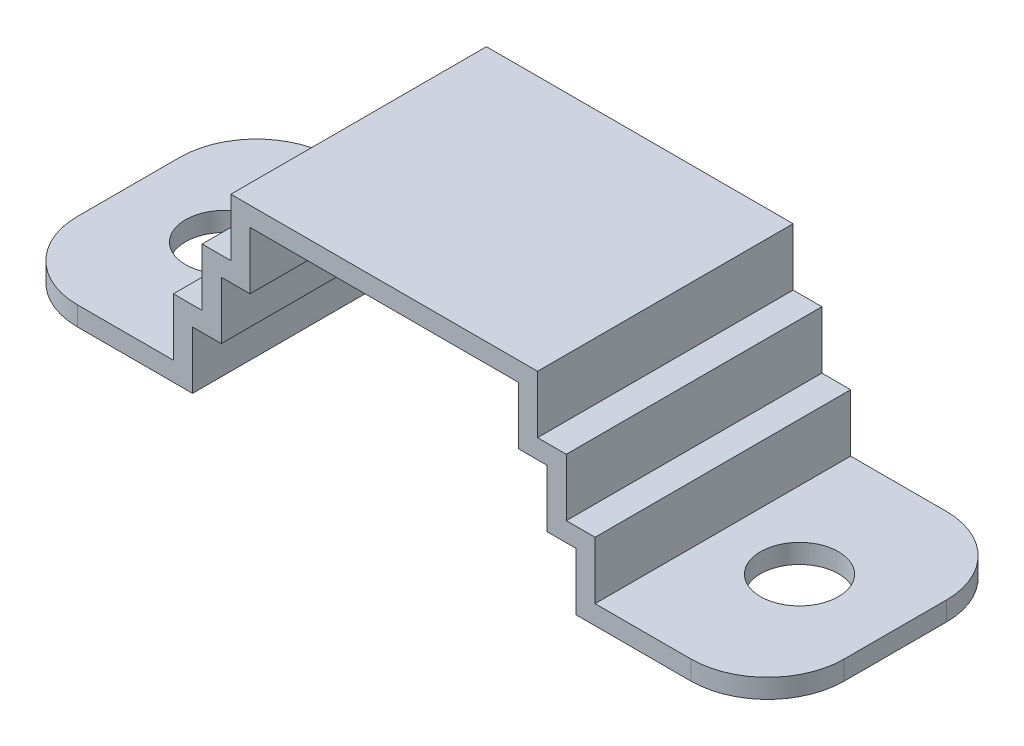
ISO-10303-21;
HEADER;
FILE_DESCRIPTION(('STEP AP214'),'2;1');
FILE_NAME('part.step','',(''),(''),'','','');
FILE_SCHEMA(('AUTOMOTIVE_DESIGN { 1 0 10303 214 1 1 1 1 }'));
ENDSEC;
DATA;
#1=APPLICATION_CONTEXT('core data for automotive mechanical design processes');
#2=APPLICATION_PROTOCOL_DEFINITION('international standard','automotive_design',2000,#1);
#3=PRODUCT_CONTEXT('',#1,'mechanical');
#4=PRODUCT('Part','Part','',(#3));
#5=PRODUCT_RELATED_PRODUCT_CATEGORY('part','',(#4));
#6=PRODUCT_DEFINITION_FORMATION('','',#4);
#7=PRODUCT_DEFINITION_CONTEXT('part definition',#1,'design');
#8=PRODUCT_DEFINITION('design','',#6,#7);
#9=PRODUCT_DEFINITION_SHAPE('','',#8);
#10=(LENGTH_UNIT() NAMED_UNIT(*) SI_UNIT(.MILLI.,.METRE.));
#11=(NAMED_UNIT(*) PLANE_ANGLE_UNIT() SI_UNIT($,.RADIAN.));
#12=(NAMED_UNIT(*) SI_UNIT($,.STERADIAN.) SOLID_ANGLE_UNIT());
#13=UNCERTAINTY_MEASURE_WITH_UNIT(LENGTH_MEASURE(1.E-05),#10,'distance_accuracy_value','');
#14=(GEOMETRIC_REPRESENTATION_CONTEXT(3) GLOBAL_UNCERTAINTY_ASSIGNED_CONTEXT((#13)) GLOBAL_UNIT_ASSIGNED_CONTEXT((#10,
#11,#12)) REPRESENTATION_CONTEXT('',''));
#15=CARTESIAN_POINT('',(0.,0.,0.));
#16=DIRECTION('',(0.,0.,1.));
#17=DIRECTION('',(1.,0.,0.));
#18=AXIS2_PLACEMENT_3D('',#15,#16,#17);
#19=CARTESIAN_POINT('',(-21.,27.,-20.));
#20=DIRECTION('',(0.,-1.,0.));
#21=DIRECTION('',(0.,0.,-1.));
#22=AXIS2_PLACEMENT_3D('',#19,#20,#21);
#23=PLANE('',#22);
#24=DIRECTION('',(1.,0.,0.));
#25=VECTOR('',#24,1.);
#26=CARTESIAN_POINT('',(-21.,27.,20.));
#27=LINE('',#26,#25);
#28=CARTESIAN_POINT('',(-21.,27.,20.));
#29=VERTEX_POINT('',#28);
#30=CARTESIAN_POINT('',(21.,27.,20.));
#31=VERTEX_POINT('',#30);
#32=EDGE_CURVE('E319',#29,#31,#27,.T.);
#33=ORIENTED_EDGE('',*,*,#32,.F.);
#34=DIRECTION('',(0.,0.,1.));
#35=VECTOR('',#34,1.);
#36=CARTESIAN_POINT('',(-21.,27.,-20.));
#37=LINE('',#36,#35);
#38=CARTESIAN_POINT('',(-21.,27.,-20.));
#39=VERTEX_POINT('',#38);
#40=EDGE_CURVE('E257',#39,#29,#37,.T.);
#41=ORIENTED_EDGE('',*,*,#40,.F.);
#42=DIRECTION('',(1.,0.,0.));
#43=VECTOR('',#42,1.);
#44=CARTESIAN_POINT('',(-21.,27.,-20.));
#45=LINE('',#44,#43);
#46=CARTESIAN_POINT('',(21.,27.,-20.));
#47=VERTEX_POINT('',#46);
#48=EDGE_CURVE('E252',#39,#47,#45,.T.);
#49=ORIENTED_EDGE('',*,*,#48,.T.);
#50=DIRECTION('',(0.,0.,1.));
#51=VECTOR('',#50,1.);
#52=CARTESIAN_POINT('',(21.,27.,-20.));
#53=LINE('',#52,#51);
#54=EDGE_CURVE('E256',#47,#31,#53,.T.);
#55=ORIENTED_EDGE('',*,*,#54,.T.);
#56=EDGE_LOOP('',(#33,#41,#49,#55));
#57=FACE_BOUND('',#56,.T.);
#58=ADVANCED_FACE('F42',(#57),#23,.T.);
#59=CARTESIAN_POINT('',(-21.,18.,-20.));
#60=DIRECTION('',(1.,0.,0.));
#61=DIRECTION('',(0.,0.,-1.));
#62=AXIS2_PLACEMENT_3D('',#59,#60,#61);
#63=PLANE('',#62);
#64=DIRECTION('',(0.,1.,0.));
#65=VECTOR('',#64,1.);
#66=CARTESIAN_POINT('',(-21.,18.,20.));
#67=LINE('',#66,#65);
#68=CARTESIAN_POINT('',(-21.,18.,20.));
#69=VERTEX_POINT('',#68);
#70=EDGE_CURVE('E262',#69,#29,#67,.T.);
#71=ORIENTED_EDGE('',*,*,#70,.F.);
#72=DIRECTION('',(0.,0.,1.));
#73=VECTOR('',#72,1.);
#74=CARTESIAN_POINT('',(-21.,18.,-20.));
#75=LINE('',#74,#73);
#76=CARTESIAN_POINT('',(-21.,18.,-20.));
#77=VERTEX_POINT('',#76);
#78=EDGE_CURVE('E354',#77,#69,#75,.T.);
#79=ORIENTED_EDGE('',*,*,#78,.F.);
#80=DIRECTION('',(0.,1.,0.));
#81=VECTOR('',#80,1.);
#82=CARTESIAN_POINT('',(-21.,18.,-20.));
#83=LINE('',#82,#81);
#84=EDGE_CURVE('E316',#77,#39,#83,.T.);
#85=ORIENTED_EDGE('',*,*,#84,.T.);
#86=ORIENTED_EDGE('',*,*,#40,.T.);
#87=EDGE_LOOP('',(#71,#79,#85,#86));
#88=FACE_BOUND('',#87,.T.);
#89=ADVANCED_FACE('F603',(#88),#63,.T.);
#90=CARTESIAN_POINT('',(-25.5,18.,-20.));
#91=DIRECTION('',(0.,-1.,0.));
#92=DIRECTION('',(0.,0.,-1.));
#93=AXIS2_PLACEMENT_3D('',#90,#91,#92);
#94=PLANE('',#93);
#95=DIRECTION('',(1.,0.,0.));
#96=VECTOR('',#95,1.);
#97=CARTESIAN_POINT('',(-25.5,18.,20.));
#98=LINE('',#97,#96);
#99=CARTESIAN_POINT('',(-25.5,18.,20.));
#100=VERTEX_POINT('',#99);
#101=EDGE_CURVE('E347',#100,#69,#98,.T.);
#102=ORIENTED_EDGE('',*,*,#101,.F.);
#103=DIRECTION('',(0.,0.,1.));
#104=VECTOR('',#103,1.);
#105=CARTESIAN_POINT('',(-25.5,18.,-20.));
#106=LINE('',#105,#104);
#107=CARTESIAN_POINT('',(-25.5,18.,-20.));
#108=VERTEX_POINT('',#107);
#109=EDGE_CURVE('E356',#108,#100,#106,.T.);
#110=ORIENTED_EDGE('',*,*,#109,.F.);
#111=DIRECTION('',(1.,0.,0.));
#112=VECTOR('',#111,1.);
#113=CARTESIAN_POINT('',(-25.5,18.,-20.));
#114=LINE('',#113,#112);
#115=EDGE_CURVE('E313',#108,#77,#114,.T.);
#116=ORIENTED_EDGE('',*,*,#115,.T.);
#117=ORIENTED_EDGE('',*,*,#78,.T.);
#118=EDGE_LOOP('',(#102,#110,#116,#117));
#119=FACE_BOUND('',#118,.T.);
#120=ADVANCED_FACE('F600',(#119),#94,.T.);
#121=CARTESIAN_POINT('',(-25.5,9.,-20.));
#122=DIRECTION('',(1.,0.,0.));
#123=DIRECTION('',(0.,0.,-1.));
#124=AXIS2_PLACEMENT_3D('',#121,#122,#123);
#125=PLANE('',#124);
#126=DIRECTION('',(0.,1.,0.));
#127=VECTOR('',#126,1.);
#128=CARTESIAN_POINT('',(-25.5,9.,20.));
#129=LINE('',#128,#127);
#130=CARTESIAN_POINT('',(-25.5,9.,20.));
#131=VERTEX_POINT('',#130);
#132=EDGE_CURVE('E344',#131,#100,#129,.T.);
#133=ORIENTED_EDGE('',*,*,#132,.F.);
#134=DIRECTION('',(0.,0.,1.));
#135=VECTOR('',#134,1.);
#136=CARTESIAN_POINT('',(-25.5,9.,-20.));
#137=LINE('',#136,#135);
#138=CARTESIAN_POINT('',(-25.5,9.,-20.));
#139=VERTEX_POINT('',#138);
#140=EDGE_CURVE('E358',#139,#131,#137,.T.);
#141=ORIENTED_EDGE('',*,*,#140,.F.);
#142=DIRECTION('',(0.,1.,0.));
#143=VECTOR('',#142,1.);
#144=CARTESIAN_POINT('',(-25.5,9.,-20.));
#145=LINE('',#144,#143);
#146=EDGE_CURVE('E310',#139,#108,#145,.T.);
#147=ORIENTED_EDGE('',*,*,#146,.T.);
#148=ORIENTED_EDGE('',*,*,#109,.T.);
#149=EDGE_LOOP('',(#133,#141,#147,#148));
#150=FACE_BOUND('',#149,.T.);
#151=ADVANCED_FACE('F596',(#150),#125,.T.);
#152=CARTESIAN_POINT('',(-30.,9.,-20.));
#153=DIRECTION('',(0.,-1.,0.));
#154=DIRECTION('',(0.,0.,-1.));
#155=AXIS2_PLACEMENT_3D('',#152,#153,#154);
#156=PLANE('',#155);
#157=DIRECTION('',(1.,0.,0.));
#158=VECTOR('',#157,1.);
#159=CARTESIAN_POINT('',(-30.,9.,20.));
#160=LINE('',#159,#158);
#161=CARTESIAN_POINT('',(-30.,9.,20.));
#162=VERTEX_POINT('',#161);
#163=EDGE_CURVE('E341',#162,#131,#160,.T.);
#164=ORIENTED_EDGE('',*,*,#163,.F.);
#165=DIRECTION('',(0.,0.,1.));
#166=VECTOR('',#165,1.);
#167=CARTESIAN_POINT('',(-30.,9.,-20.));
#168=LINE('',#167,#166);
#169=CARTESIAN_POINT('',(-30.,9.,-20.));
#170=VERTEX_POINT('',#169);
#171=EDGE_CURVE('E360',#170,#162,#168,.T.);
#172=ORIENTED_EDGE('',*,*,#171,.F.);
#173=DIRECTION('',(1.,0.,0.));
#174=VECTOR('',#173,1.);
#175=CARTESIAN_POINT('',(-30.,9.,-20.));
#176=LINE('',#175,#174);
#177=EDGE_CURVE('E307',#170,#139,#176,.T.);
#178=ORIENTED_EDGE('',*,*,#177,.T.);
#179=ORIENTED_EDGE('',*,*,#140,.T.);
#180=EDGE_LOOP('',(#164,#172,#178,#179));
#181=FACE_BOUND('',#180,.T.);
#182=ADVANCED_FACE('F593',(#181),#156,.T.);
#183=CARTESIAN_POINT('',(-30.,0.,-20.));
#184=DIRECTION('',(1.,0.,0.));
#185=DIRECTION('',(0.,0.,-1.));
#186=AXIS2_PLACEMENT_3D('',#183,#184,#185);
#187=PLANE('',#186);
#188=DIRECTION('',(0.,1.,0.));
#189=VECTOR('',#188,1.);
#190=CARTESIAN_POINT('',(-30.,0.,20.));
#191=LINE('',#190,#189);
#192=CARTESIAN_POINT('',(-30.,0.,20.));
#193=VERTEX_POINT('',#192);
#194=EDGE_CURVE('E338',#193,#162,#191,.T.);
#195=ORIENTED_EDGE('',*,*,#194,.F.);
#196=DIRECTION('',(0.,0.,1.));
#197=VECTOR('',#196,1.);
#198=CARTESIAN_POINT('',(-30.,0.,-20.));
#199=LINE('',#198,#197);
#200=CARTESIAN_POINT('',(-30.,0.,-20.));
#201=VERTEX_POINT('',#200);
#202=EDGE_CURVE('E362',#201,#193,#199,.T.);
#203=ORIENTED_EDGE('',*,*,#202,.F.);
#204=DIRECTION('',(0.,1.,0.));
#205=VECTOR('',#204,1.);
#206=CARTESIAN_POINT('',(-30.,0.,-20.));
#207=LINE('',#206,#205);
#208=EDGE_CURVE('E304',#201,#170,#207,.T.);
#209=ORIENTED_EDGE('',*,*,#208,.T.);
#210=ORIENTED_EDGE('',*,*,#171,.T.);
#211=EDGE_LOOP('',(#195,#203,#209,#210));
#212=FACE_BOUND('',#211,.T.);
#213=ADVANCED_FACE('F589',(#212),#187,.T.);
#214=CARTESIAN_POINT('',(-60.,0.,-20.));
#215=DIRECTION('',(0.,-1.,0.));
#216=DIRECTION('',(0.,0.,-1.));
#217=AXIS2_PLACEMENT_3D('',#214,#215,#216);
#218=PLANE('',#217);
#219=CARTESIAN_POINT('',(-45.,0.,0.));
#220=DIRECTION('',(0.,1.,0.));
#221=DIRECTION('',(0.,0.,1.));
#222=AXIS2_PLACEMENT_3D('',#219,#220,#221);
#223=CIRCLE('',#222,6.1);
#224=CARTESIAN_POINT('',(-45.,0.,6.1));
#225=VERTEX_POINT('',#224);
#226=EDGE_CURVE('E468',#225,#225,#223,.T.);
#227=ORIENTED_EDGE('',*,*,#226,.T.);
#228=EDGE_LOOP('',(#227));
#229=FACE_BOUND('',#228,.T.);
#230=DIRECTION('',(0.,0.,1.));
#231=VECTOR('',#230,1.);
#232=CARTESIAN_POINT('',(-60.,0.,-20.));
#233=LINE('',#232,#231);
#234=CARTESIAN_POINT('',(-60.,0.,-8.));
#235=VERTEX_POINT('',#234);
#236=CARTESIAN_POINT('',(-60.,0.,8.));
#237=VERTEX_POINT('',#236);
#238=EDGE_CURVE('E365',#235,#237,#233,.T.);
#239=ORIENTED_EDGE('',*,*,#238,.F.);
#240=CARTESIAN_POINT('',(-48.,0.,-8.));
#241=DIRECTION('',(0.,-1.,0.));
#242=DIRECTION('',(0.,0.,-1.));
#243=AXIS2_PLACEMENT_3D('',#240,#241,#242);
#244=CIRCLE('',#243,12.);
#245=CARTESIAN_POINT('',(-48.,0.,-20.));
#246=VERTEX_POINT('',#245);
#247=EDGE_CURVE('E403',#235,#246,#244,.T.);
#248=ORIENTED_EDGE('',*,*,#247,.T.);
#249=DIRECTION('',(1.,0.,0.));
#250=VECTOR('',#249,1.);
#251=CARTESIAN_POINT('',(-60.,0.,-20.));
#252=LINE('',#251,#250);
#253=EDGE_CURVE('E302',#246,#201,#252,.T.);
#254=ORIENTED_EDGE('',*,*,#253,.T.);
#255=ORIENTED_EDGE('',*,*,#202,.T.);
#256=DIRECTION('',(1.,0.,0.));
#257=VECTOR('',#256,1.);
#258=CARTESIAN_POINT('',(-60.,0.,20.));
#259=LINE('',#258,#257);
#260=CARTESIAN_POINT('',(-48.,0.,20.));
#261=VERTEX_POINT('',#260);
#262=EDGE_CURVE('E336',#261,#193,#259,.T.);
#263=ORIENTED_EDGE('',*,*,#262,.F.);
#264=CARTESIAN_POINT('',(-48.,0.,8.));
#265=DIRECTION('',(0.,-1.,0.));
#266=DIRECTION('',(0.,0.,-1.));
#267=AXIS2_PLACEMENT_3D('',#264,#265,#266);
#268=CIRCLE('',#267,12.);
#269=EDGE_CURVE('E401',#261,#237,#268,.T.);
#270=ORIENTED_EDGE('',*,*,#269,.T.);
#271=EDGE_LOOP('',(#239,#248,#254,#255,#263,#270));
#272=FACE_BOUND('',#271,.T.);
#273=ADVANCED_FACE('F579',(#229,#272),#218,.T.);
#274=CARTESIAN_POINT('',(-60.,0.,-20.));
#275=DIRECTION('',(1.,0.,0.));
#276=DIRECTION('',(0.,0.,-1.));
#277=AXIS2_PLACEMENT_3D('',#274,#275,#276);
#278=PLANE('',#277);
#279=DIRECTION('',(0.,0.,1.));
#280=VECTOR('',#279,1.);
#281=CARTESIAN_POINT('',(-60.,3.,-20.));
#282=LINE('',#281,#280);
#283=CARTESIAN_POINT('',(-60.,3.,-8.));
#284=VERTEX_POINT('',#283);
#285=CARTESIAN_POINT('',(-60.,3.,8.));
#286=VERTEX_POINT('',#285);
#287=EDGE_CURVE('E368',#284,#286,#282,.T.);
#288=ORIENTED_EDGE('',*,*,#287,.F.);
#289=DIRECTION('',(0.,1.,0.));
#290=VECTOR('',#289,1.);
#291=CARTESIAN_POINT('',(-60.,0.,-8.));
#292=LINE('',#291,#290);
#293=EDGE_CURVE('E399',#284,#235,#292,.F.);
#294=ORIENTED_EDGE('',*,*,#293,.T.);
#295=ORIENTED_EDGE('',*,*,#238,.T.);
#296=DIRECTION('',(0.,1.,0.));
#297=VECTOR('',#296,1.);
#298=CARTESIAN_POINT('',(-60.,0.,8.));
#299=LINE('',#298,#297);
#300=EDGE_CURVE('E396',#237,#286,#299,.T.);
#301=ORIENTED_EDGE('',*,*,#300,.T.);
#302=EDGE_LOOP('',(#288,#294,#295,#301));
#303=FACE_BOUND('',#302,.T.);
#304=ADVANCED_FACE('F574',(#303),#278,.F.);
#305=CARTESIAN_POINT('',(-60.,3.,-20.));
#306=DIRECTION('',(0.,-1.,0.));
#307=DIRECTION('',(0.,0.,-1.));
#308=AXIS2_PLACEMENT_3D('',#305,#306,#307);
#309=PLANE('',#308);
#310=CARTESIAN_POINT('',(-45.,3.,0.));
#311=DIRECTION('',(0.,1.,0.));
#312=DIRECTION('',(0.,0.,1.));
#313=AXIS2_PLACEMENT_3D('',#310,#311,#312);
#314=CIRCLE('',#313,6.1);
#315=CARTESIAN_POINT('',(-45.,3.,6.1));
#316=VERTEX_POINT('',#315);
#317=EDGE_CURVE('E660',#316,#316,#314,.T.);
#318=ORIENTED_EDGE('',*,*,#317,.F.);
#319=EDGE_LOOP('',(#318));
#320=FACE_BOUND('',#319,.T.);
#321=DIRECTION('',(1.,0.,0.));
#322=VECTOR('',#321,1.);
#323=CARTESIAN_POINT('',(-60.,3.,-20.));
#324=LINE('',#323,#322);
#325=CARTESIAN_POINT('',(-48.,3.,-20.));
#326=VERTEX_POINT('',#325);
#327=CARTESIAN_POINT('',(-33.,3.,-20.));
#328=VERTEX_POINT('',#327);
#329=EDGE_CURVE('E300',#326,#328,#324,.T.);
#330=ORIENTED_EDGE('',*,*,#329,.F.);
#331=CARTESIAN_POINT('',(-48.,3.,-8.));
#332=DIRECTION('',(0.,-1.,0.));
#333=DIRECTION('',(0.,0.,-1.));
#334=AXIS2_PLACEMENT_3D('',#331,#332,#333);
#335=CIRCLE('',#334,12.);
#336=EDGE_CURVE('E394',#326,#284,#335,.F.);
#337=ORIENTED_EDGE('',*,*,#336,.T.);
#338=ORIENTED_EDGE('',*,*,#287,.T.);
#339=CARTESIAN_POINT('',(-48.,3.,8.));
#340=DIRECTION('',(0.,-1.,0.));
#341=DIRECTION('',(0.,0.,-1.));
#342=AXIS2_PLACEMENT_3D('',#339,#340,#341);
#343=CIRCLE('',#342,12.);
#344=CARTESIAN_POINT('',(-48.,3.,20.));
#345=VERTEX_POINT('',#344);
#346=EDGE_CURVE('E392',#286,#345,#343,.F.);
#347=ORIENTED_EDGE('',*,*,#346,.T.);
#348=DIRECTION('',(1.,0.,0.));
#349=VECTOR('',#348,1.);
#350=CARTESIAN_POINT('',(-60.,3.,20.));
#351=LINE('',#350,#349);
#352=CARTESIAN_POINT('',(-33.,3.,20.));
#353=VERTEX_POINT('',#352);
#354=EDGE_CURVE('E334',#345,#353,#351,.T.);
#355=ORIENTED_EDGE('',*,*,#354,.T.);
#356=DIRECTION('',(0.,0.,1.));
#357=VECTOR('',#356,1.);
#358=CARTESIAN_POINT('',(-33.,3.,-20.));
#359=LINE('',#358,#357);
#360=EDGE_CURVE('E371',#328,#353,#359,.T.);
#361=ORIENTED_EDGE('',*,*,#360,.F.);
#362=EDGE_LOOP('',(#330,#337,#338,#347,#355,#361));
#363=FACE_BOUND('',#362,.T.);
#364=ADVANCED_FACE('F567',(#320,#363),#309,.F.);
#365=CARTESIAN_POINT('',(-33.,0.,-20.));
#366=DIRECTION('',(1.,0.,0.));
#367=DIRECTION('',(0.,0.,-1.));
#368=AXIS2_PLACEMENT_3D('',#365,#366,#367);
#369=PLANE('',#368);
#370=DIRECTION('',(0.,1.,0.));
#371=VECTOR('',#370,1.);
#372=CARTESIAN_POINT('',(-33.,0.,20.));
#373=LINE('',#372,#371);
#374=CARTESIAN_POINT('',(-33.,12.,20.));
#375=VERTEX_POINT('',#374);
#376=EDGE_CURVE('E332',#353,#375,#373,.T.);
#377=ORIENTED_EDGE('',*,*,#376,.T.);
#378=DIRECTION('',(0.,0.,1.));
#379=VECTOR('',#378,1.);
#380=CARTESIAN_POINT('',(-33.,12.,-20.));
#381=LINE('',#380,#379);
#382=CARTESIAN_POINT('',(-33.,12.,-20.));
#383=VERTEX_POINT('',#382);
#384=EDGE_CURVE('E374',#383,#375,#381,.T.);
#385=ORIENTED_EDGE('',*,*,#384,.F.);
#386=DIRECTION('',(0.,1.,0.));
#387=VECTOR('',#386,1.);
#388=CARTESIAN_POINT('',(-33.,0.,-20.));
#389=LINE('',#388,#387);
#390=EDGE_CURVE('E298',#328,#383,#389,.T.);
#391=ORIENTED_EDGE('',*,*,#390,.F.);
#392=ORIENTED_EDGE('',*,*,#360,.T.);
#393=EDGE_LOOP('',(#377,#385,#391,#392));
#394=FACE_BOUND('',#393,.T.);
#395=ADVANCED_FACE('F562',(#394),#369,.F.);
#396=CARTESIAN_POINT('',(-30.,12.,-20.));
#397=DIRECTION('',(0.,-1.,0.));
#398=DIRECTION('',(0.,0.,-1.));
#399=AXIS2_PLACEMENT_3D('',#396,#397,#398);
#400=PLANE('',#399);
#401=DIRECTION('',(1.,0.,0.));
#402=VECTOR('',#401,1.);
#403=CARTESIAN_POINT('',(-30.,12.,20.));
#404=LINE('',#403,#402);
#405=CARTESIAN_POINT('',(-28.5,12.,20.));
#406=VERTEX_POINT('',#405);
#407=EDGE_CURVE('E330',#375,#406,#404,.T.);
#408=ORIENTED_EDGE('',*,*,#407,.T.);
#409=DIRECTION('',(0.,0.,1.));
#410=VECTOR('',#409,1.);
#411=CARTESIAN_POINT('',(-28.5,12.,-20.));
#412=LINE('',#411,#410);
#413=CARTESIAN_POINT('',(-28.5,12.,-20.));
#414=VERTEX_POINT('',#413);
#415=EDGE_CURVE('E377',#414,#406,#412,.T.);
#416=ORIENTED_EDGE('',*,*,#415,.F.);
#417=DIRECTION('',(1.,0.,0.));
#418=VECTOR('',#417,1.);
#419=CARTESIAN_POINT('',(-30.,12.,-20.));
#420=LINE('',#419,#418);
#421=EDGE_CURVE('E296',#383,#414,#420,.T.);
#422=ORIENTED_EDGE('',*,*,#421,.F.);
#423=ORIENTED_EDGE('',*,*,#384,.T.);
#424=EDGE_LOOP('',(#408,#416,#422,#423));
#425=FACE_BOUND('',#424,.T.);
#426=ADVANCED_FACE('F557',(#425),#400,.F.);
#427=CARTESIAN_POINT('',(-28.5,9.,-20.));
#428=DIRECTION('',(1.,0.,0.));
#429=DIRECTION('',(0.,0.,-1.));
#430=AXIS2_PLACEMENT_3D('',#427,#428,#429);
#431=PLANE('',#430);
#432=DIRECTION('',(0.,1.,0.));
#433=VECTOR('',#432,1.);
#434=CARTESIAN_POINT('',(-28.5,9.,20.));
#435=LINE('',#434,#433);
#436=CARTESIAN_POINT('',(-28.5,21.,20.));
#437=VERTEX_POINT('',#436);
#438=EDGE_CURVE('E328',#406,#437,#435,.T.);
#439=ORIENTED_EDGE('',*,*,#438,.T.);
#440=DIRECTION('',(0.,0.,1.));
#441=VECTOR('',#440,1.);
#442=CARTESIAN_POINT('',(-28.5,21.,-20.));
#443=LINE('',#442,#441);
#444=CARTESIAN_POINT('',(-28.5,21.,-20.));
#445=VERTEX_POINT('',#444);
#446=EDGE_CURVE('E380',#445,#437,#443,.T.);
#447=ORIENTED_EDGE('',*,*,#446,.F.);
#448=DIRECTION('',(0.,1.,0.));
#449=VECTOR('',#448,1.);
#450=CARTESIAN_POINT('',(-28.5,9.,-20.));
#451=LINE('',#450,#449);
#452=EDGE_CURVE('E294',#414,#445,#451,.T.);
#453=ORIENTED_EDGE('',*,*,#452,.F.);
#454=ORIENTED_EDGE('',*,*,#415,.T.);
#455=EDGE_LOOP('',(#439,#447,#453,#454));
#456=FACE_BOUND('',#455,.T.);
#457=ADVANCED_FACE('F553',(#456),#431,.F.);
#458=CARTESIAN_POINT('',(-25.5,21.,-20.));
#459=DIRECTION('',(0.,-1.,0.));
#460=DIRECTION('',(0.,0.,-1.));
#461=AXIS2_PLACEMENT_3D('',#458,#459,#460);
#462=PLANE('',#461);
#463=DIRECTION('',(1.,0.,0.));
#464=VECTOR('',#463,1.);
#465=CARTESIAN_POINT('',(-25.5,21.,20.));
#466=LINE('',#465,#464);
#467=CARTESIAN_POINT('',(-24.,21.,20.));
#468=VERTEX_POINT('',#467);
#469=EDGE_CURVE('E326',#437,#468,#466,.T.);
#470=ORIENTED_EDGE('',*,*,#469,.T.);
#471=DIRECTION('',(0.,0.,1.));
#472=VECTOR('',#471,1.);
#473=CARTESIAN_POINT('',(-24.,21.,-20.));
#474=LINE('',#473,#472);
#475=CARTESIAN_POINT('',(-24.,21.,-20.));
#476=VERTEX_POINT('',#475);
#477=EDGE_CURVE('E383',#476,#468,#474,.T.);
#478=ORIENTED_EDGE('',*,*,#477,.F.);
#479=DIRECTION('',(1.,0.,0.));
#480=VECTOR('',#479,1.);
#481=CARTESIAN_POINT('',(-25.5,21.,-20.));
#482=LINE('',#481,#480);
#483=EDGE_CURVE('E292',#445,#476,#482,.T.);
#484=ORIENTED_EDGE('',*,*,#483,.F.);
#485=ORIENTED_EDGE('',*,*,#446,.T.);
#486=EDGE_LOOP('',(#470,#478,#484,#485));
#487=FACE_BOUND('',#486,.T.);
#488=ADVANCED_FACE('F548',(#487),#462,.F.);
#489=CARTESIAN_POINT('',(-24.,18.,-20.));
#490=DIRECTION('',(1.,0.,0.));
#491=DIRECTION('',(0.,0.,-1.));
#492=AXIS2_PLACEMENT_3D('',#489,#490,#491);
#493=PLANE('',#492);
#494=DIRECTION('',(0.,1.,0.));
#495=VECTOR('',#494,1.);
#496=CARTESIAN_POINT('',(-24.,18.,20.));
#497=LINE('',#496,#495);
#498=CARTESIAN_POINT('',(-24.,30.,20.));
#499=VERTEX_POINT('',#498);
#500=EDGE_CURVE('E324',#468,#499,#497,.T.);
#501=ORIENTED_EDGE('',*,*,#500,.T.);
#502=DIRECTION('',(0.,0.,1.));
#503=VECTOR('',#502,1.);
#504=CARTESIAN_POINT('',(-24.,30.,-20.));
#505=LINE('',#504,#503);
#506=CARTESIAN_POINT('',(-24.,30.,-20.));
#507=VERTEX_POINT('',#506);
#508=EDGE_CURVE('E318',#507,#499,#505,.T.);
#509=ORIENTED_EDGE('',*,*,#508,.F.);
#510=DIRECTION('',(0.,1.,0.));
#511=VECTOR('',#510,1.);
#512=CARTESIAN_POINT('',(-24.,18.,-20.));
#513=LINE('',#512,#511);
#514=EDGE_CURVE('E290',#476,#507,#513,.T.);
#515=ORIENTED_EDGE('',*,*,#514,.F.);
#516=ORIENTED_EDGE('',*,*,#477,.T.);
#517=EDGE_LOOP('',(#501,#509,#515,#516));
#518=FACE_BOUND('',#517,.T.);
#519=ADVANCED_FACE('F542',(#518),#493,.F.);
#520=CARTESIAN_POINT('',(-21.,30.,-20.));
#521=DIRECTION('',(0.,-1.,0.));
#522=DIRECTION('',(0.,0.,-1.));
#523=AXIS2_PLACEMENT_3D('',#520,#521,#522);
#524=PLANE('',#523);
#525=DIRECTION('',(1.,0.,0.));
#526=VECTOR('',#525,1.);
#527=CARTESIAN_POINT('',(-21.,30.,20.));
#528=LINE('',#527,#526);
#529=CARTESIAN_POINT('',(24.,30.,20.));
#530=VERTEX_POINT('',#529);
#531=EDGE_CURVE('E321',#499,#530,#528,.T.);
#532=ORIENTED_EDGE('',*,*,#531,.T.);
#533=DIRECTION('',(0.,0.,1.));
#534=VECTOR('',#533,1.);
#535=CARTESIAN_POINT('',(24.,30.,-20.));
#536=LINE('',#535,#534);
#537=CARTESIAN_POINT('',(24.,30.,-20.));
#538=VERTEX_POINT('',#537);
#539=EDGE_CURVE('E322',#538,#530,#536,.T.);
#540=ORIENTED_EDGE('',*,*,#539,.F.);
#541=DIRECTION('',(1.,0.,0.));
#542=VECTOR('',#541,1.);
#543=CARTESIAN_POINT('',(-21.,30.,-20.));
#544=LINE('',#543,#542);
#545=EDGE_CURVE('E261',#507,#538,#544,.T.);
#546=ORIENTED_EDGE('',*,*,#545,.F.);
#547=ORIENTED_EDGE('',*,*,#508,.T.);
#548=EDGE_LOOP('',(#532,#540,#546,#547));
#549=FACE_BOUND('',#548,.T.);
#550=ADVANCED_FACE('F538',(#549),#524,.F.);
#551=CARTESIAN_POINT('',(0.,0.,-20.));
#552=DIRECTION('',(0.,0.,-1.));
#553=DIRECTION('',(-1.,0.,0.));
#554=AXIS2_PLACEMENT_3D('',#551,#552,#553);
#555=PLANE('',#554);
#556=ORIENTED_EDGE('',*,*,#253,.F.);
#557=DIRECTION('',(0.,1.,0.));
#558=VECTOR('',#557,1.);
#559=CARTESIAN_POINT('',(-48.,3.,-20.));
#560=LINE('',#559,#558);
#561=EDGE_CURVE('E389',#246,#326,#560,.T.);
#562=ORIENTED_EDGE('',*,*,#561,.T.);
#563=ORIENTED_EDGE('',*,*,#329,.T.);
#564=ORIENTED_EDGE('',*,*,#390,.T.);
#565=ORIENTED_EDGE('',*,*,#421,.T.);
#566=ORIENTED_EDGE('',*,*,#452,.T.);
#567=ORIENTED_EDGE('',*,*,#483,.T.);
#568=ORIENTED_EDGE('',*,*,#514,.T.);
#569=ORIENTED_EDGE('',*,*,#545,.T.);
#570=DIRECTION('',(0.,1.,0.));
#571=VECTOR('',#570,1.);
#572=CARTESIAN_POINT('',(24.,18.,-20.));
#573=LINE('',#572,#571);
#574=CARTESIAN_POINT('',(24.,21.,-20.));
#575=VERTEX_POINT('',#574);
#576=EDGE_CURVE('E280',#575,#538,#573,.T.);
#577=ORIENTED_EDGE('',*,*,#576,.F.);
#578=DIRECTION('',(-1.,0.,0.));
#579=VECTOR('',#578,1.);
#580=CARTESIAN_POINT('',(25.5,21.,-20.));
#581=LINE('',#580,#579);
#582=CARTESIAN_POINT('',(28.5,21.,-20.));
#583=VERTEX_POINT('',#582);
#584=EDGE_CURVE('E285',#583,#575,#581,.T.);
#585=ORIENTED_EDGE('',*,*,#584,.F.);
#586=DIRECTION('',(0.,1.,0.));
#587=VECTOR('',#586,1.);
#588=CARTESIAN_POINT('',(28.5,9.,-20.));
#589=LINE('',#588,#587);
#590=CARTESIAN_POINT('',(28.5,12.,-20.));
#591=VERTEX_POINT('',#590);
#592=EDGE_CURVE('E514',#591,#583,#589,.T.);
#593=ORIENTED_EDGE('',*,*,#592,.F.);
#594=DIRECTION('',(-1.,0.,0.));
#595=VECTOR('',#594,1.);
#596=CARTESIAN_POINT('',(30.,12.,-20.));
#597=LINE('',#596,#595);
#598=CARTESIAN_POINT('',(33.,12.,-20.));
#599=VERTEX_POINT('',#598);
#600=EDGE_CURVE('E512',#599,#591,#597,.T.);
#601=ORIENTED_EDGE('',*,*,#600,.F.);
#602=DIRECTION('',(0.,1.,0.));
#603=VECTOR('',#602,1.);
#604=CARTESIAN_POINT('',(33.,0.,-20.));
#605=LINE('',#604,#603);
#606=CARTESIAN_POINT('',(33.,3.,-20.));
#607=VERTEX_POINT('',#606);
#608=EDGE_CURVE('E502',#607,#599,#605,.T.);
#609=ORIENTED_EDGE('',*,*,#608,.F.);
#610=DIRECTION('',(-1.,0.,0.));
#611=VECTOR('',#610,1.);
#612=CARTESIAN_POINT('',(60.,3.,-20.));
#613=LINE('',#612,#611);
#614=CARTESIAN_POINT('',(48.,3.,-20.));
#615=VERTEX_POINT('',#614);
#616=EDGE_CURVE('E510',#615,#607,#613,.T.);
#617=ORIENTED_EDGE('',*,*,#616,.F.);
#618=DIRECTION('',(0.,1.,0.));
#619=VECTOR('',#618,1.);
#620=CARTESIAN_POINT('',(48.,0.,-20.));
#621=LINE('',#620,#619);
#622=CARTESIAN_POINT('',(48.,0.,-20.));
#623=VERTEX_POINT('',#622);
#624=EDGE_CURVE('E353',#615,#623,#621,.F.);
#625=ORIENTED_EDGE('',*,*,#624,.T.);
#626=DIRECTION('',(-1.,0.,0.));
#627=VECTOR('',#626,1.);
#628=CARTESIAN_POINT('',(60.,0.,-20.));
#629=LINE('',#628,#627);
#630=CARTESIAN_POINT('',(30.,0.,-20.));
#631=VERTEX_POINT('',#630);
#632=EDGE_CURVE('E516',#623,#631,#629,.T.);
#633=ORIENTED_EDGE('',*,*,#632,.T.);
#634=DIRECTION('',(0.,1.,0.));
#635=VECTOR('',#634,1.);
#636=CARTESIAN_POINT('',(30.,0.,-20.));
#637=LINE('',#636,#635);
#638=CARTESIAN_POINT('',(30.,9.,-20.));
#639=VERTEX_POINT('',#638);
#640=EDGE_CURVE('E652',#631,#639,#637,.T.);
#641=ORIENTED_EDGE('',*,*,#640,.T.);
#642=DIRECTION('',(-1.,0.,0.));
#643=VECTOR('',#642,1.);
#644=CARTESIAN_POINT('',(30.,9.,-20.));
#645=LINE('',#644,#643);
#646=CARTESIAN_POINT('',(25.5,9.,-20.));
#647=VERTEX_POINT('',#646);
#648=EDGE_CURVE('E653',#639,#647,#645,.T.);
#649=ORIENTED_EDGE('',*,*,#648,.T.);
#650=DIRECTION('',(0.,1.,0.));
#651=VECTOR('',#650,1.);
#652=CARTESIAN_POINT('',(25.5,9.,-20.));
#653=LINE('',#652,#651);
#654=CARTESIAN_POINT('',(25.5,18.,-20.));
#655=VERTEX_POINT('',#654);
#656=EDGE_CURVE('E657',#647,#655,#653,.T.);
#657=ORIENTED_EDGE('',*,*,#656,.T.);
#658=DIRECTION('',(-1.,0.,0.));
#659=VECTOR('',#658,1.);
#660=CARTESIAN_POINT('',(25.5,18.,-20.));
#661=LINE('',#660,#659);
#662=CARTESIAN_POINT('',(21.,18.,-20.));
#663=VERTEX_POINT('',#662);
#664=EDGE_CURVE('E269',#655,#663,#661,.T.);
#665=ORIENTED_EDGE('',*,*,#664,.T.);
#666=DIRECTION('',(0.,1.,0.));
#667=VECTOR('',#666,1.);
#668=CARTESIAN_POINT('',(21.,18.,-20.));
#669=LINE('',#668,#667);
#670=EDGE_CURVE('E265',#663,#47,#669,.T.);
#671=ORIENTED_EDGE('',*,*,#670,.T.);
#672=ORIENTED_EDGE('',*,*,#48,.F.);
#673=ORIENTED_EDGE('',*,*,#84,.F.);
#674=ORIENTED_EDGE('',*,*,#115,.F.);
#675=ORIENTED_EDGE('',*,*,#146,.F.);
#676=ORIENTED_EDGE('',*,*,#177,.F.);
#677=ORIENTED_EDGE('',*,*,#208,.F.);
#678=EDGE_LOOP('',(#556,#562,#563,#564,#565,#566,#567,#568,#569,#577,#585,#593,#601,#609,#617,
#625,#633,#641,#649,#657,#665,#671,#672,#673,#674,#675,#676,#677));
#679=FACE_BOUND('',#678,.T.);
#680=ADVANCED_FACE('F267',(#679),#555,.T.);
#681=CARTESIAN_POINT('',(0.,0.,20.));
#682=DIRECTION('',(0.,0.,-1.));
#683=DIRECTION('',(-1.,0.,0.));
#684=AXIS2_PLACEMENT_3D('',#681,#682,#683);
#685=PLANE('',#684);
#686=ORIENTED_EDGE('',*,*,#354,.F.);
#687=DIRECTION('',(0.,1.,0.));
#688=VECTOR('',#687,1.);
#689=CARTESIAN_POINT('',(-48.,0.,20.));
#690=LINE('',#689,#688);
#691=EDGE_CURVE('E408',#345,#261,#690,.F.);
#692=ORIENTED_EDGE('',*,*,#691,.T.);
#693=ORIENTED_EDGE('',*,*,#262,.T.);
#694=ORIENTED_EDGE('',*,*,#194,.T.);
#695=ORIENTED_EDGE('',*,*,#163,.T.);
#696=ORIENTED_EDGE('',*,*,#132,.T.);
#697=ORIENTED_EDGE('',*,*,#101,.T.);
#698=ORIENTED_EDGE('',*,*,#70,.T.);
#699=ORIENTED_EDGE('',*,*,#32,.T.);
#700=DIRECTION('',(0.,1.,0.));
#701=VECTOR('',#700,1.);
#702=CARTESIAN_POINT('',(21.,18.,20.));
#703=LINE('',#702,#701);
#704=CARTESIAN_POINT('',(21.,18.,20.));
#705=VERTEX_POINT('',#704);
#706=EDGE_CURVE('E278',#705,#31,#703,.T.);
#707=ORIENTED_EDGE('',*,*,#706,.F.);
#708=DIRECTION('',(-1.,0.,0.));
#709=VECTOR('',#708,1.);
#710=CARTESIAN_POINT('',(25.5,18.,20.));
#711=LINE('',#710,#709);
#712=CARTESIAN_POINT('',(25.5,18.,20.));
#713=VERTEX_POINT('',#712);
#714=EDGE_CURVE('E460',#713,#705,#711,.T.);
#715=ORIENTED_EDGE('',*,*,#714,.F.);
#716=DIRECTION('',(0.,1.,0.));
#717=VECTOR('',#716,1.);
#718=CARTESIAN_POINT('',(25.5,9.,20.));
#719=LINE('',#718,#717);
#720=CARTESIAN_POINT('',(25.5,9.,20.));
#721=VERTEX_POINT('',#720);
#722=EDGE_CURVE('E464',#721,#713,#719,.T.);
#723=ORIENTED_EDGE('',*,*,#722,.F.);
#724=DIRECTION('',(-1.,0.,0.));
#725=VECTOR('',#724,1.);
#726=CARTESIAN_POINT('',(30.,9.,20.));
#727=LINE('',#726,#725);
#728=CARTESIAN_POINT('',(30.,9.,20.));
#729=VERTEX_POINT('',#728);
#730=EDGE_CURVE('E466',#729,#721,#727,.T.);
#731=ORIENTED_EDGE('',*,*,#730,.F.);
#732=DIRECTION('',(0.,1.,0.));
#733=VECTOR('',#732,1.);
#734=CARTESIAN_POINT('',(30.,0.,20.));
#735=LINE('',#734,#733);
#736=CARTESIAN_POINT('',(30.,0.,20.));
#737=VERTEX_POINT('',#736);
#738=EDGE_CURVE('E434',#737,#729,#735,.T.);
#739=ORIENTED_EDGE('',*,*,#738,.F.);
#740=DIRECTION('',(-1.,0.,0.));
#741=VECTOR('',#740,1.);
#742=CARTESIAN_POINT('',(60.,0.,20.));
#743=LINE('',#742,#741);
#744=CARTESIAN_POINT('',(48.,0.,20.));
#745=VERTEX_POINT('',#744);
#746=EDGE_CURVE('E422',#745,#737,#743,.T.);
#747=ORIENTED_EDGE('',*,*,#746,.F.);
#748=DIRECTION('',(0.,1.,0.));
#749=VECTOR('',#748,1.);
#750=CARTESIAN_POINT('',(48.,3.,20.));
#751=LINE('',#750,#749);
#752=CARTESIAN_POINT('',(48.,3.,20.));
#753=VERTEX_POINT('',#752);
#754=EDGE_CURVE('E405',#745,#753,#751,.T.);
#755=ORIENTED_EDGE('',*,*,#754,.T.);
#756=DIRECTION('',(-1.,0.,0.));
#757=VECTOR('',#756,1.);
#758=CARTESIAN_POINT('',(60.,3.,20.));
#759=LINE('',#758,#757);
#760=CARTESIAN_POINT('',(33.,3.,20.));
#761=VERTEX_POINT('',#760);
#762=EDGE_CURVE('E435',#753,#761,#759,.T.);
#763=ORIENTED_EDGE('',*,*,#762,.T.);
#764=DIRECTION('',(0.,1.,0.));
#765=VECTOR('',#764,1.);
#766=CARTESIAN_POINT('',(33.,0.,20.));
#767=LINE('',#766,#765);
#768=CARTESIAN_POINT('',(33.,12.,20.));
#769=VERTEX_POINT('',#768);
#770=EDGE_CURVE('E474',#761,#769,#767,.T.);
#771=ORIENTED_EDGE('',*,*,#770,.T.);
#772=DIRECTION('',(-1.,0.,0.));
#773=VECTOR('',#772,1.);
#774=CARTESIAN_POINT('',(30.,12.,20.));
#775=LINE('',#774,#773);
#776=CARTESIAN_POINT('',(28.5,12.,20.));
#777=VERTEX_POINT('',#776);
#778=EDGE_CURVE('E477',#769,#777,#775,.T.);
#779=ORIENTED_EDGE('',*,*,#778,.T.);
#780=DIRECTION('',(0.,1.,0.));
#781=VECTOR('',#780,1.);
#782=CARTESIAN_POINT('',(28.5,9.,20.));
#783=LINE('',#782,#781);
#784=CARTESIAN_POINT('',(28.5,21.,20.));
#785=VERTEX_POINT('',#784);
#786=EDGE_CURVE('E480',#777,#785,#783,.T.);
#787=ORIENTED_EDGE('',*,*,#786,.T.);
#788=DIRECTION('',(-1.,0.,0.));
#789=VECTOR('',#788,1.);
#790=CARTESIAN_POINT('',(25.5,21.,20.));
#791=LINE('',#790,#789);
#792=CARTESIAN_POINT('',(24.,21.,20.));
#793=VERTEX_POINT('',#792);
#794=EDGE_CURVE('E483',#785,#793,#791,.T.);
#795=ORIENTED_EDGE('',*,*,#794,.T.);
#796=DIRECTION('',(0.,1.,0.));
#797=VECTOR('',#796,1.);
#798=CARTESIAN_POINT('',(24.,18.,20.));
#799=LINE('',#798,#797);
#800=EDGE_CURVE('E273',#793,#530,#799,.T.);
#801=ORIENTED_EDGE('',*,*,#800,.T.);
#802=ORIENTED_EDGE('',*,*,#531,.F.);
#803=ORIENTED_EDGE('',*,*,#500,.F.);
#804=ORIENTED_EDGE('',*,*,#469,.F.);
#805=ORIENTED_EDGE('',*,*,#438,.F.);
#806=ORIENTED_EDGE('',*,*,#407,.F.);
#807=ORIENTED_EDGE('',*,*,#376,.F.);
#808=EDGE_LOOP('',(#686,#692,#693,#694,#695,#696,#697,#698,#699,#707,#715,#723,#731,#739,#747,
#755,#763,#771,#779,#787,#795,#801,#802,#803,#804,#805,#806,#807));
#809=FACE_BOUND('',#808,.T.);
#810=ADVANCED_FACE('F432',(#809),#685,.F.);
#811=CARTESIAN_POINT('',(24.,18.,-20.));
#812=DIRECTION('',(1.,0.,0.));
#813=DIRECTION('',(0.,0.,-1.));
#814=AXIS2_PLACEMENT_3D('',#811,#812,#813);
#815=PLANE('',#814);
#816=ORIENTED_EDGE('',*,*,#800,.F.);
#817=DIRECTION('',(0.,0.,1.));
#818=VECTOR('',#817,1.);
#819=CARTESIAN_POINT('',(24.,21.,-20.));
#820=LINE('',#819,#818);
#821=EDGE_CURVE('E490',#575,#793,#820,.T.);
#822=ORIENTED_EDGE('',*,*,#821,.F.);
#823=ORIENTED_EDGE('',*,*,#576,.T.);
#824=ORIENTED_EDGE('',*,*,#539,.T.);
#825=EDGE_LOOP('',(#816,#822,#823,#824));
#826=FACE_BOUND('',#825,.T.);
#827=ADVANCED_FACE('F534',(#826),#815,.T.);
#828=CARTESIAN_POINT('',(25.5,21.,-20.));
#829=DIRECTION('',(0.,1.,0.));
#830=DIRECTION('',(0.,0.,1.));
#831=AXIS2_PLACEMENT_3D('',#828,#829,#830);
#832=PLANE('',#831);
#833=ORIENTED_EDGE('',*,*,#794,.F.);
#834=DIRECTION('',(0.,0.,1.));
#835=VECTOR('',#834,1.);
#836=CARTESIAN_POINT('',(28.5,21.,-20.));
#837=LINE('',#836,#835);
#838=EDGE_CURVE('E492',#583,#785,#837,.T.);
#839=ORIENTED_EDGE('',*,*,#838,.F.);
#840=ORIENTED_EDGE('',*,*,#584,.T.);
#841=ORIENTED_EDGE('',*,*,#821,.T.);
#842=EDGE_LOOP('',(#833,#839,#840,#841));
#843=FACE_BOUND('',#842,.T.);
#844=ADVANCED_FACE('F526',(#843),#832,.T.);
#845=CARTESIAN_POINT('',(28.5,9.,-20.));
#846=DIRECTION('',(1.,0.,0.));
#847=DIRECTION('',(0.,0.,-1.));
#848=AXIS2_PLACEMENT_3D('',#845,#846,#847);
#849=PLANE('',#848);
#850=ORIENTED_EDGE('',*,*,#786,.F.);
#851=DIRECTION('',(0.,0.,1.));
#852=VECTOR('',#851,1.);
#853=CARTESIAN_POINT('',(28.5,12.,-20.));
#854=LINE('',#853,#852);
#855=EDGE_CURVE('E494',#591,#777,#854,.T.);
#856=ORIENTED_EDGE('',*,*,#855,.F.);
#857=ORIENTED_EDGE('',*,*,#592,.T.);
#858=ORIENTED_EDGE('',*,*,#838,.T.);
#859=EDGE_LOOP('',(#850,#856,#857,#858));
#860=FACE_BOUND('',#859,.T.);
#861=ADVANCED_FACE('F530',(#860),#849,.T.);
#862=CARTESIAN_POINT('',(30.,12.,-20.));
#863=DIRECTION('',(0.,1.,0.));
#864=DIRECTION('',(0.,0.,1.));
#865=AXIS2_PLACEMENT_3D('',#862,#863,#864);
#866=PLANE('',#865);
#867=ORIENTED_EDGE('',*,*,#778,.F.);
#868=DIRECTION('',(0.,0.,1.));
#869=VECTOR('',#868,1.);
#870=CARTESIAN_POINT('',(33.,12.,-20.));
#871=LINE('',#870,#869);
#872=EDGE_CURVE('E443',#599,#769,#871,.T.);
#873=ORIENTED_EDGE('',*,*,#872,.F.);
#874=ORIENTED_EDGE('',*,*,#600,.T.);
#875=ORIENTED_EDGE('',*,*,#855,.T.);
#876=EDGE_LOOP('',(#867,#873,#874,#875));
#877=FACE_BOUND('',#876,.T.);
#878=ADVANCED_FACE('F506',(#877),#866,.T.);
#879=CARTESIAN_POINT('',(33.,0.,-20.));
#880=DIRECTION('',(1.,0.,0.));
#881=DIRECTION('',(0.,0.,-1.));
#882=AXIS2_PLACEMENT_3D('',#879,#880,#881);
#883=PLANE('',#882);
#884=ORIENTED_EDGE('',*,*,#770,.F.);
#885=DIRECTION('',(0.,0.,1.));
#886=VECTOR('',#885,1.);
#887=CARTESIAN_POINT('',(33.,3.,-20.));
#888=LINE('',#887,#886);
#889=EDGE_CURVE('E440',#607,#761,#888,.T.);
#890=ORIENTED_EDGE('',*,*,#889,.F.);
#891=ORIENTED_EDGE('',*,*,#608,.T.);
#892=ORIENTED_EDGE('',*,*,#872,.T.);
#893=EDGE_LOOP('',(#884,#890,#891,#892));
#894=FACE_BOUND('',#893,.T.);
#895=ADVANCED_FACE('F499',(#894),#883,.T.);
#896=CARTESIAN_POINT('',(60.,3.,-20.));
#897=DIRECTION('',(0.,1.,0.));
#898=DIRECTION('',(0.,0.,1.));
#899=AXIS2_PLACEMENT_3D('',#896,#897,#898);
#900=PLANE('',#899);
#901=CARTESIAN_POINT('',(45.,3.,0.));
#902=DIRECTION('',(0.,-1.,0.));
#903=DIRECTION('',(0.,0.,1.));
#904=AXIS2_PLACEMENT_3D('',#901,#902,#903);
#905=CIRCLE('',#904,6.1);
#906=CARTESIAN_POINT('',(45.,3.,6.1));
#907=VERTEX_POINT('',#906);
#908=EDGE_CURVE('E666',#907,#907,#905,.T.);
#909=ORIENTED_EDGE('',*,*,#908,.T.);
#910=EDGE_LOOP('',(#909));
#911=FACE_BOUND('',#910,.T.);
#912=DIRECTION('',(0.,0.,1.));
#913=VECTOR('',#912,1.);
#914=CARTESIAN_POINT('',(60.,3.,-20.));
#915=LINE('',#914,#913);
#916=CARTESIAN_POINT('',(60.,3.,-8.));
#917=VERTEX_POINT('',#916);
#918=CARTESIAN_POINT('',(60.,3.,8.));
#919=VERTEX_POINT('',#918);
#920=EDGE_CURVE('E439',#917,#919,#915,.T.);
#921=ORIENTED_EDGE('',*,*,#920,.F.);
#922=CARTESIAN_POINT('',(48.,3.,-8.));
#923=DIRECTION('',(0.,1.,0.));
#924=DIRECTION('',(0.,0.,1.));
#925=AXIS2_PLACEMENT_3D('',#922,#923,#924);
#926=CIRCLE('',#925,12.);
#927=EDGE_CURVE('E65',#917,#615,#926,.T.);
#928=ORIENTED_EDGE('',*,*,#927,.T.);
#929=ORIENTED_EDGE('',*,*,#616,.T.);
#930=ORIENTED_EDGE('',*,*,#889,.T.);
#931=ORIENTED_EDGE('',*,*,#762,.F.);
#932=CARTESIAN_POINT('',(48.,3.,8.));
#933=DIRECTION('',(0.,1.,0.));
#934=DIRECTION('',(0.,0.,1.));
#935=AXIS2_PLACEMENT_3D('',#932,#933,#934);
#936=CIRCLE('',#935,12.);
#937=EDGE_CURVE('E57',#753,#919,#936,.T.);
#938=ORIENTED_EDGE('',*,*,#937,.T.);
#939=EDGE_LOOP('',(#921,#928,#929,#930,#931,#938));
#940=FACE_BOUND('',#939,.T.);
#941=ADVANCED_FACE('F508',(#911,#940),#900,.T.);
#942=CARTESIAN_POINT('',(60.,0.,-20.));
#943=DIRECTION('',(1.,0.,0.));
#944=DIRECTION('',(0.,0.,-1.));
#945=AXIS2_PLACEMENT_3D('',#942,#943,#944);
#946=PLANE('',#945);
#947=DIRECTION('',(0.,0.,1.));
#948=VECTOR('',#947,1.);
#949=CARTESIAN_POINT('',(60.,0.,-20.));
#950=LINE('',#949,#948);
#951=CARTESIAN_POINT('',(60.,0.,-8.));
#952=VERTEX_POINT('',#951);
#953=CARTESIAN_POINT('',(60.,0.,8.));
#954=VERTEX_POINT('',#953);
#955=EDGE_CURVE('E425',#952,#954,#950,.T.);
#956=ORIENTED_EDGE('',*,*,#955,.F.);
#957=DIRECTION('',(0.,1.,0.));
#958=VECTOR('',#957,1.);
#959=CARTESIAN_POINT('',(60.,0.,-8.));
#960=LINE('',#959,#958);
#961=EDGE_CURVE('E412',#952,#917,#960,.T.);
#962=ORIENTED_EDGE('',*,*,#961,.T.);
#963=ORIENTED_EDGE('',*,*,#920,.T.);
#964=DIRECTION('',(0.,1.,0.));
#965=VECTOR('',#964,1.);
#966=CARTESIAN_POINT('',(60.,0.,8.));
#967=LINE('',#966,#965);
#968=EDGE_CURVE('E410',#919,#954,#967,.F.);
#969=ORIENTED_EDGE('',*,*,#968,.T.);
#970=EDGE_LOOP('',(#956,#962,#963,#969));
#971=FACE_BOUND('',#970,.T.);
#972=ADVANCED_FACE('F438',(#971),#946,.T.);
#973=CARTESIAN_POINT('',(60.,0.,-20.));
#974=DIRECTION('',(0.,1.,0.));
#975=DIRECTION('',(0.,0.,1.));
#976=AXIS2_PLACEMENT_3D('',#973,#974,#975);
#977=PLANE('',#976);
#978=CARTESIAN_POINT('',(45.,0.,0.));
#979=DIRECTION('',(0.,-1.,0.));
#980=DIRECTION('',(0.,0.,1.));
#981=AXIS2_PLACEMENT_3D('',#978,#979,#980);
#982=CIRCLE('',#981,6.1);
#983=CARTESIAN_POINT('',(45.,0.,6.1));
#984=VERTEX_POINT('',#983);
#985=EDGE_CURVE('E663',#984,#984,#982,.T.);
#986=ORIENTED_EDGE('',*,*,#985,.F.);
#987=EDGE_LOOP('',(#986));
#988=FACE_BOUND('',#987,.T.);
#989=ORIENTED_EDGE('',*,*,#632,.F.);
#990=CARTESIAN_POINT('',(48.,0.,-8.));
#991=DIRECTION('',(0.,1.,0.));
#992=DIRECTION('',(0.,0.,1.));
#993=AXIS2_PLACEMENT_3D('',#990,#991,#992);
#994=CIRCLE('',#993,12.);
#995=EDGE_CURVE('E11',#623,#952,#994,.F.);
#996=ORIENTED_EDGE('',*,*,#995,.T.);
#997=ORIENTED_EDGE('',*,*,#955,.T.);
#998=CARTESIAN_POINT('',(48.,0.,8.));
#999=DIRECTION('',(0.,1.,0.));
#1000=DIRECTION('',(0.,0.,1.));
#1001=AXIS2_PLACEMENT_3D('',#998,#999,#1000);
#1002=CIRCLE('',#1001,12.);
#1003=EDGE_CURVE('E50',#954,#745,#1002,.F.);
#1004=ORIENTED_EDGE('',*,*,#1003,.T.);
#1005=ORIENTED_EDGE('',*,*,#746,.T.);
#1006=DIRECTION('',(0.,0.,1.));
#1007=VECTOR('',#1006,1.);
#1008=CARTESIAN_POINT('',(30.,0.,-20.));
#1009=LINE('',#1008,#1007);
#1010=EDGE_CURVE('E445',#631,#737,#1009,.T.);
#1011=ORIENTED_EDGE('',*,*,#1010,.F.);
#1012=EDGE_LOOP('',(#989,#996,#997,#1004,#1005,#1011));
#1013=FACE_BOUND('',#1012,.T.);
#1014=ADVANCED_FACE('F420',(#988,#1013),#977,.F.);
#1015=CARTESIAN_POINT('',(30.,0.,-20.));
#1016=DIRECTION('',(1.,0.,0.));
#1017=DIRECTION('',(0.,0.,-1.));
#1018=AXIS2_PLACEMENT_3D('',#1015,#1016,#1017);
#1019=PLANE('',#1018);
#1020=ORIENTED_EDGE('',*,*,#738,.T.);
#1021=DIRECTION('',(0.,0.,1.));
#1022=VECTOR('',#1021,1.);
#1023=CARTESIAN_POINT('',(30.,9.,-20.));
#1024=LINE('',#1023,#1022);
#1025=EDGE_CURVE('E450',#639,#729,#1024,.T.);
#1026=ORIENTED_EDGE('',*,*,#1025,.F.);
#1027=ORIENTED_EDGE('',*,*,#640,.F.);
#1028=ORIENTED_EDGE('',*,*,#1010,.T.);
#1029=EDGE_LOOP('',(#1020,#1026,#1027,#1028));
#1030=FACE_BOUND('',#1029,.T.);
#1031=ADVANCED_FACE('F675',(#1030),#1019,.F.);
#1032=CARTESIAN_POINT('',(30.,9.,-20.));
#1033=DIRECTION('',(0.,1.,0.));
#1034=DIRECTION('',(0.,0.,1.));
#1035=AXIS2_PLACEMENT_3D('',#1032,#1033,#1034);
#1036=PLANE('',#1035);
#1037=ORIENTED_EDGE('',*,*,#730,.T.);
#1038=DIRECTION('',(0.,0.,1.));
#1039=VECTOR('',#1038,1.);
#1040=CARTESIAN_POINT('',(25.5,9.,-20.));
#1041=LINE('',#1040,#1039);
#1042=EDGE_CURVE('E453',#647,#721,#1041,.T.);
#1043=ORIENTED_EDGE('',*,*,#1042,.F.);
#1044=ORIENTED_EDGE('',*,*,#648,.F.);
#1045=ORIENTED_EDGE('',*,*,#1025,.T.);
#1046=EDGE_LOOP('',(#1037,#1043,#1044,#1045));
#1047=FACE_BOUND('',#1046,.T.);
#1048=ADVANCED_FACE('F681',(#1047),#1036,.F.);
#1049=CARTESIAN_POINT('',(25.5,9.,-20.));
#1050=DIRECTION('',(1.,0.,0.));
#1051=DIRECTION('',(0.,0.,-1.));
#1052=AXIS2_PLACEMENT_3D('',#1049,#1050,#1051);
#1053=PLANE('',#1052);
#1054=ORIENTED_EDGE('',*,*,#722,.T.);
#1055=DIRECTION('',(0.,0.,1.));
#1056=VECTOR('',#1055,1.);
#1057=CARTESIAN_POINT('',(25.5,18.,-20.));
#1058=LINE('',#1057,#1056);
#1059=EDGE_CURVE('E282',#655,#713,#1058,.T.);
#1060=ORIENTED_EDGE('',*,*,#1059,.F.);
#1061=ORIENTED_EDGE('',*,*,#656,.F.);
#1062=ORIENTED_EDGE('',*,*,#1042,.T.);
#1063=EDGE_LOOP('',(#1054,#1060,#1061,#1062));
#1064=FACE_BOUND('',#1063,.T.);
#1065=ADVANCED_FACE('F689',(#1064),#1053,.F.);
#1066=CARTESIAN_POINT('',(25.5,18.,-20.));
#1067=DIRECTION('',(0.,1.,0.));
#1068=DIRECTION('',(0.,0.,1.));
#1069=AXIS2_PLACEMENT_3D('',#1066,#1067,#1068);
#1070=PLANE('',#1069);
#1071=ORIENTED_EDGE('',*,*,#714,.T.);
#1072=DIRECTION('',(0.,0.,1.));
#1073=VECTOR('',#1072,1.);
#1074=CARTESIAN_POINT('',(21.,18.,-20.));
#1075=LINE('',#1074,#1073);
#1076=EDGE_CURVE('E279',#663,#705,#1075,.T.);
#1077=ORIENTED_EDGE('',*,*,#1076,.F.);
#1078=ORIENTED_EDGE('',*,*,#664,.F.);
#1079=ORIENTED_EDGE('',*,*,#1059,.T.);
#1080=EDGE_LOOP('',(#1071,#1077,#1078,#1079));
#1081=FACE_BOUND('',#1080,.T.);
#1082=ADVANCED_FACE('F459',(#1081),#1070,.F.);
#1083=CARTESIAN_POINT('',(21.,18.,-20.));
#1084=DIRECTION('',(1.,0.,0.));
#1085=DIRECTION('',(0.,0.,-1.));
#1086=AXIS2_PLACEMENT_3D('',#1083,#1084,#1085);
#1087=PLANE('',#1086);
#1088=ORIENTED_EDGE('',*,*,#706,.T.);
#1089=ORIENTED_EDGE('',*,*,#54,.F.);
#1090=ORIENTED_EDGE('',*,*,#670,.F.);
#1091=ORIENTED_EDGE('',*,*,#1076,.T.);
#1092=EDGE_LOOP('',(#1088,#1089,#1090,#1091));
#1093=FACE_BOUND('',#1092,.T.);
#1094=ADVANCED_FACE('F276',(#1093),#1087,.F.);
#1095=CARTESIAN_POINT('',(-45.,0.,0.));
#1096=DIRECTION('',(0.,1.,0.));
#1097=DIRECTION('',(0.,0.,1.));
#1098=AXIS2_PLACEMENT_3D('',#1095,#1096,#1097);
#1099=CYLINDRICAL_SURFACE('',#1098,6.1);
#1100=ORIENTED_EDGE('',*,*,#226,.F.);
#1101=EDGE_LOOP('',(#1100));
#1102=FACE_BOUND('',#1101,.T.);
#1103=ORIENTED_EDGE('',*,*,#317,.T.);
#1104=EDGE_LOOP('',(#1103));
#1105=FACE_BOUND('',#1104,.T.);
#1106=ADVANCED_FACE('F696',(#1102,#1105),#1099,.F.);
#1107=CARTESIAN_POINT('',(45.,0.,0.));
#1108=DIRECTION('',(0.,1.,0.));
#1109=DIRECTION('',(0.,0.,1.));
#1110=AXIS2_PLACEMENT_3D('',#1107,#1108,#1109);
#1111=CYLINDRICAL_SURFACE('',#1110,6.1);
#1112=ORIENTED_EDGE('',*,*,#985,.T.);
#1113=EDGE_LOOP('',(#1112));
#1114=FACE_BOUND('',#1113,.T.);
#1115=ORIENTED_EDGE('',*,*,#908,.F.);
#1116=EDGE_LOOP('',(#1115));
#1117=FACE_BOUND('',#1116,.T.);
#1118=ADVANCED_FACE('F643',(#1114,#1117),#1111,.F.);
#1119=CARTESIAN_POINT('',(-48.,0.,-8.));
#1120=DIRECTION('',(0.,-1.,0.));
#1121=DIRECTION('',(0.,0.,-1.));
#1122=AXIS2_PLACEMENT_3D('',#1119,#1120,#1121);
#1123=CYLINDRICAL_SURFACE('',#1122,12.);
#1124=ORIENTED_EDGE('',*,*,#247,.F.);
#1125=ORIENTED_EDGE('',*,*,#293,.F.);
#1126=ORIENTED_EDGE('',*,*,#336,.F.);
#1127=ORIENTED_EDGE('',*,*,#561,.F.);
#1128=EDGE_LOOP('',(#1124,#1125,#1126,#1127));
#1129=FACE_BOUND('',#1128,.T.);
#1130=ADVANCED_FACE('F583',(#1129),#1123,.T.);
#1131=CARTESIAN_POINT('',(-48.,0.,8.));
#1132=DIRECTION('',(0.,1.,0.));
#1133=DIRECTION('',(0.,0.,1.));
#1134=AXIS2_PLACEMENT_3D('',#1131,#1132,#1133);
#1135=CYLINDRICAL_SURFACE('',#1134,12.);
#1136=ORIENTED_EDGE('',*,*,#269,.F.);
#1137=ORIENTED_EDGE('',*,*,#691,.F.);
#1138=ORIENTED_EDGE('',*,*,#346,.F.);
#1139=ORIENTED_EDGE('',*,*,#300,.F.);
#1140=EDGE_LOOP('',(#1136,#1137,#1138,#1139));
#1141=FACE_BOUND('',#1140,.T.);
#1142=ADVANCED_FACE('F572',(#1141),#1135,.T.);
#1143=CARTESIAN_POINT('',(48.,0.,-8.));
#1144=DIRECTION('',(0.,1.,0.));
#1145=DIRECTION('',(0.,0.,1.));
#1146=AXIS2_PLACEMENT_3D('',#1143,#1144,#1145);
#1147=CYLINDRICAL_SURFACE('',#1146,12.);
#1148=ORIENTED_EDGE('',*,*,#995,.F.);
#1149=ORIENTED_EDGE('',*,*,#624,.F.);
#1150=ORIENTED_EDGE('',*,*,#927,.F.);
#1151=ORIENTED_EDGE('',*,*,#961,.F.);
#1152=EDGE_LOOP('',(#1148,#1149,#1150,#1151));
#1153=FACE_BOUND('',#1152,.T.);
#1154=ADVANCED_FACE('F645',(#1153),#1147,.T.);
#1155=CARTESIAN_POINT('',(48.,0.,8.));
#1156=DIRECTION('',(0.,-1.,0.));
#1157=DIRECTION('',(0.,0.,-1.));
#1158=AXIS2_PLACEMENT_3D('',#1155,#1156,#1157);
#1159=CYLINDRICAL_SURFACE('',#1158,12.);
#1160=ORIENTED_EDGE('',*,*,#1003,.F.);
#1161=ORIENTED_EDGE('',*,*,#968,.F.);
#1162=ORIENTED_EDGE('',*,*,#937,.F.);
#1163=ORIENTED_EDGE('',*,*,#754,.F.);
#1164=EDGE_LOOP('',(#1160,#1161,#1162,#1163));
#1165=FACE_BOUND('',#1164,.T.);
#1166=ADVANCED_FACE('F44',(#1165),#1159,.T.);
#1167=CLOSED_SHELL('',(#58,#89,#120,#151,#182,#213,#273,#304,#364,#395,#426,#457,#488,#519,#550,
#680,#810,#827,#844,#861,#878,#895,#941,#972,#1014,#1031,#1048,#1065,#1082,#1094,#1106,#1118,
#1130,#1142,#1154,#1166));
#1168=MANIFOLD_SOLID_BREP('B2',#1167);
#1169=ADVANCED_BREP_SHAPE_REPRESENTATION('',(#18,#1168),#14);
#1170=SHAPE_DEFINITION_REPRESENTATION(#9,#1169);
ENDSEC;
END-ISO-10303-21;
